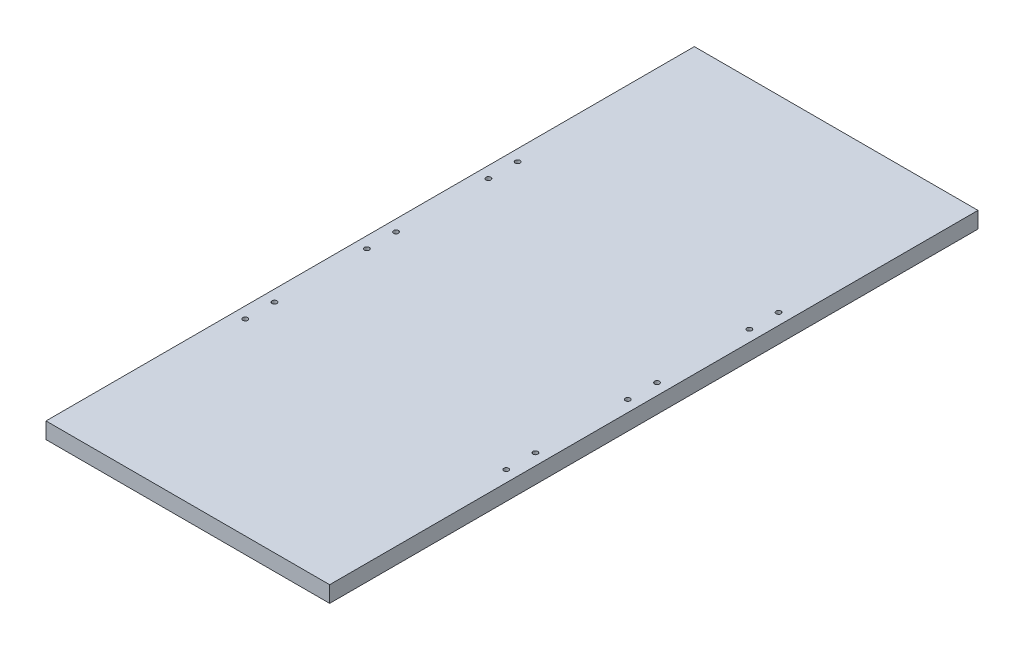
ISO-10303-21;
HEADER;
FILE_DESCRIPTION(('STEP AP214'),'2;1');
FILE_NAME('part.step','',(''),(''),'','','');
FILE_SCHEMA(('AUTOMOTIVE_DESIGN { 1 0 10303 214 1 1 1 1 }'));
ENDSEC;
DATA;
#1=APPLICATION_CONTEXT('core data for automotive mechanical design processes');
#2=APPLICATION_PROTOCOL_DEFINITION('international standard','automotive_design',2000,#1);
#3=PRODUCT_CONTEXT('',#1,'mechanical');
#4=PRODUCT('Part','Part','',(#3));
#5=PRODUCT_RELATED_PRODUCT_CATEGORY('part','',(#4));
#6=PRODUCT_DEFINITION_FORMATION('','',#4);
#7=PRODUCT_DEFINITION_CONTEXT('part definition',#1,'design');
#8=PRODUCT_DEFINITION('design','',#6,#7);
#9=PRODUCT_DEFINITION_SHAPE('','',#8);
#10=(LENGTH_UNIT() NAMED_UNIT(*) SI_UNIT(.MILLI.,.METRE.));
#11=(NAMED_UNIT(*) PLANE_ANGLE_UNIT() SI_UNIT($,.RADIAN.));
#12=(NAMED_UNIT(*) SI_UNIT($,.STERADIAN.) SOLID_ANGLE_UNIT());
#13=UNCERTAINTY_MEASURE_WITH_UNIT(LENGTH_MEASURE(1.E-05),#10,'distance_accuracy_value','');
#14=(GEOMETRIC_REPRESENTATION_CONTEXT(3) GLOBAL_UNCERTAINTY_ASSIGNED_CONTEXT((#13)) GLOBAL_UNIT_ASSIGNED_CONTEXT((#10,
#11,#12)) REPRESENTATION_CONTEXT('',''));
#15=CARTESIAN_POINT('',(0.,0.,0.));
#16=DIRECTION('',(0.,0.,1.));
#17=DIRECTION('',(1.,0.,0.));
#18=AXIS2_PLACEMENT_3D('',#15,#16,#17);
#19=CARTESIAN_POINT('',(87.4999999999999,10.,-200.));
#20=DIRECTION('',(-1.,0.,0.));
#21=DIRECTION('',(0.,0.,1.));
#22=AXIS2_PLACEMENT_3D('',#19,#20,#21);
#23=PLANE('',#22);
#24=DIRECTION('',(0.,0.,-1.));
#25=VECTOR('',#24,1.);
#26=CARTESIAN_POINT('',(87.4999999999999,0.,-200.));
#27=LINE('',#26,#25);
#28=CARTESIAN_POINT('',(87.5,0.,200.));
#29=VERTEX_POINT('',#28);
#30=CARTESIAN_POINT('',(87.4999999999999,0.,-200.));
#31=VERTEX_POINT('',#30);
#32=EDGE_CURVE('E96',#29,#31,#27,.T.);
#33=ORIENTED_EDGE('',*,*,#32,.T.);
#34=DIRECTION('',(0.,-1.,0.));
#35=VECTOR('',#34,1.);
#36=CARTESIAN_POINT('',(87.4999999999999,10.,-200.));
#37=LINE('',#36,#35);
#38=CARTESIAN_POINT('',(87.4999999999999,10.,-200.));
#39=VERTEX_POINT('',#38);
#40=EDGE_CURVE('E11',#39,#31,#37,.T.);
#41=ORIENTED_EDGE('',*,*,#40,.F.);
#42=DIRECTION('',(0.,0.,-1.));
#43=VECTOR('',#42,1.);
#44=CARTESIAN_POINT('',(87.4999999999999,10.,-200.));
#45=LINE('',#44,#43);
#46=CARTESIAN_POINT('',(87.5,10.,200.));
#47=VERTEX_POINT('',#46);
#48=EDGE_CURVE('E84',#47,#39,#45,.T.);
#49=ORIENTED_EDGE('',*,*,#48,.F.);
#50=DIRECTION('',(0.,-1.,0.));
#51=VECTOR('',#50,1.);
#52=CARTESIAN_POINT('',(87.5,10.,200.));
#53=LINE('',#52,#51);
#54=EDGE_CURVE('E92',#47,#29,#53,.T.);
#55=ORIENTED_EDGE('',*,*,#54,.T.);
#56=EDGE_LOOP('',(#33,#41,#49,#55));
#57=FACE_BOUND('',#56,.T.);
#58=ADVANCED_FACE('F33',(#57),#23,.F.);
#59=CARTESIAN_POINT('',(-87.5,10.,-200.));
#60=DIRECTION('',(0.,0.,1.));
#61=DIRECTION('',(1.,0.,0.));
#62=AXIS2_PLACEMENT_3D('',#59,#60,#61);
#63=PLANE('',#62);
#64=DIRECTION('',(-1.,0.,0.));
#65=VECTOR('',#64,1.);
#66=CARTESIAN_POINT('',(-87.5,0.,-200.));
#67=LINE('',#66,#65);
#68=CARTESIAN_POINT('',(-87.5,0.,-200.));
#69=VERTEX_POINT('',#68);
#70=EDGE_CURVE('E88',#31,#69,#67,.T.);
#71=ORIENTED_EDGE('',*,*,#70,.T.);
#72=DIRECTION('',(0.,-1.,0.));
#73=VECTOR('',#72,1.);
#74=CARTESIAN_POINT('',(-87.5,10.,-200.));
#75=LINE('',#74,#73);
#76=CARTESIAN_POINT('',(-87.5,10.,-200.));
#77=VERTEX_POINT('',#76);
#78=EDGE_CURVE('E41',#77,#69,#75,.T.);
#79=ORIENTED_EDGE('',*,*,#78,.F.);
#80=DIRECTION('',(-1.,0.,0.));
#81=VECTOR('',#80,1.);
#82=CARTESIAN_POINT('',(-87.5,10.,-200.));
#83=LINE('',#82,#81);
#84=EDGE_CURVE('E79',#39,#77,#83,.T.);
#85=ORIENTED_EDGE('',*,*,#84,.F.);
#86=ORIENTED_EDGE('',*,*,#40,.T.);
#87=EDGE_LOOP('',(#71,#79,#85,#86));
#88=FACE_BOUND('',#87,.T.);
#89=ADVANCED_FACE('F87',(#88),#63,.F.);
#90=CARTESIAN_POINT('',(-87.5,10.,-200.));
#91=DIRECTION('',(1.,0.,0.));
#92=DIRECTION('',(0.,0.,-1.));
#93=AXIS2_PLACEMENT_3D('',#90,#91,#92);
#94=PLANE('',#93);
#95=DIRECTION('',(0.,0.,1.));
#96=VECTOR('',#95,1.);
#97=CARTESIAN_POINT('',(-87.5,0.,-200.));
#98=LINE('',#97,#96);
#99=CARTESIAN_POINT('',(-87.5,0.,200.));
#100=VERTEX_POINT('',#99);
#101=EDGE_CURVE('E66',#69,#100,#98,.T.);
#102=ORIENTED_EDGE('',*,*,#101,.T.);
#103=DIRECTION('',(0.,-1.,0.));
#104=VECTOR('',#103,1.);
#105=CARTESIAN_POINT('',(-87.5,10.,200.));
#106=LINE('',#105,#104);
#107=CARTESIAN_POINT('',(-87.5,10.,200.));
#108=VERTEX_POINT('',#107);
#109=EDGE_CURVE('E89',#108,#100,#106,.T.);
#110=ORIENTED_EDGE('',*,*,#109,.F.);
#111=DIRECTION('',(0.,0.,1.));
#112=VECTOR('',#111,1.);
#113=CARTESIAN_POINT('',(-87.5,10.,-200.));
#114=LINE('',#113,#112);
#115=EDGE_CURVE('E82',#77,#108,#114,.T.);
#116=ORIENTED_EDGE('',*,*,#115,.F.);
#117=ORIENTED_EDGE('',*,*,#78,.T.);
#118=EDGE_LOOP('',(#102,#110,#116,#117));
#119=FACE_BOUND('',#118,.T.);
#120=ADVANCED_FACE('F90',(#119),#94,.F.);
#121=CARTESIAN_POINT('',(-87.5,10.,200.));
#122=DIRECTION('',(0.,0.,-1.));
#123=DIRECTION('',(-1.,0.,0.));
#124=AXIS2_PLACEMENT_3D('',#121,#122,#123);
#125=PLANE('',#124);
#126=DIRECTION('',(1.,0.,0.));
#127=VECTOR('',#126,1.);
#128=CARTESIAN_POINT('',(-87.5,0.,200.));
#129=LINE('',#128,#127);
#130=EDGE_CURVE('E72',#100,#29,#129,.T.);
#131=ORIENTED_EDGE('',*,*,#130,.T.);
#132=ORIENTED_EDGE('',*,*,#54,.F.);
#133=DIRECTION('',(1.,0.,0.));
#134=VECTOR('',#133,1.);
#135=CARTESIAN_POINT('',(-87.5,10.,200.));
#136=LINE('',#135,#134);
#137=EDGE_CURVE('E49',#108,#47,#136,.T.);
#138=ORIENTED_EDGE('',*,*,#137,.F.);
#139=ORIENTED_EDGE('',*,*,#109,.T.);
#140=EDGE_LOOP('',(#131,#132,#138,#139));
#141=FACE_BOUND('',#140,.T.);
#142=ADVANCED_FACE('F104',(#141),#125,.F.);
#143=CARTESIAN_POINT('',(0.,10.,0.));
#144=DIRECTION('',(0.,1.,0.));
#145=DIRECTION('',(0.,0.,1.));
#146=AXIS2_PLACEMENT_3D('',#143,#144,#145);
#147=PLANE('',#146);
#148=CARTESIAN_POINT('',(80.5,10.,-83.9600000000001));
#149=DIRECTION('',(0.,1.,0.));
#150=DIRECTION('',(0.,0.,-1.));
#151=AXIS2_PLACEMENT_3D('',#148,#149,#150);
#152=CIRCLE('',#151,1.5);
#153=CARTESIAN_POINT('',(80.5,10.,-85.4600000000001));
#154=VERTEX_POINT('',#153);
#155=EDGE_CURVE('E114',#154,#154,#152,.T.);
#156=ORIENTED_EDGE('',*,*,#155,.F.);
#157=EDGE_LOOP('',(#156));
#158=FACE_BOUND('',#157,.T.);
#159=CARTESIAN_POINT('',(80.5,10.,-65.9600000000001));
#160=DIRECTION('',(0.,1.,0.));
#161=DIRECTION('',(0.,0.,-1.));
#162=AXIS2_PLACEMENT_3D('',#159,#160,#161);
#163=CIRCLE('',#162,1.5);
#164=CARTESIAN_POINT('',(80.5,10.,-67.4600000000001));
#165=VERTEX_POINT('',#164);
#166=EDGE_CURVE('E173',#165,#165,#163,.T.);
#167=ORIENTED_EDGE('',*,*,#166,.F.);
#168=EDGE_LOOP('',(#167));
#169=FACE_BOUND('',#168,.T.);
#170=CARTESIAN_POINT('',(80.5,10.,-8.96000000000009));
#171=DIRECTION('',(0.,1.,0.));
#172=DIRECTION('',(0.,0.,-1.));
#173=AXIS2_PLACEMENT_3D('',#170,#171,#172);
#174=CIRCLE('',#173,1.5);
#175=CARTESIAN_POINT('',(80.5,10.,-10.4600000000001));
#176=VERTEX_POINT('',#175);
#177=EDGE_CURVE('E167',#176,#176,#174,.T.);
#178=ORIENTED_EDGE('',*,*,#177,.F.);
#179=EDGE_LOOP('',(#178));
#180=FACE_BOUND('',#179,.T.);
#181=CARTESIAN_POINT('',(80.5,10.,9.03999999999991));
#182=DIRECTION('',(0.,1.,0.));
#183=DIRECTION('',(0.,0.,-1.));
#184=AXIS2_PLACEMENT_3D('',#181,#182,#183);
#185=CIRCLE('',#184,1.5);
#186=CARTESIAN_POINT('',(80.5,10.,7.53999999999991));
#187=VERTEX_POINT('',#186);
#188=EDGE_CURVE('E161',#187,#187,#185,.T.);
#189=ORIENTED_EDGE('',*,*,#188,.F.);
#190=EDGE_LOOP('',(#189));
#191=FACE_BOUND('',#190,.T.);
#192=CARTESIAN_POINT('',(80.5,10.,66.0399999999999));
#193=DIRECTION('',(0.,1.,0.));
#194=DIRECTION('',(0.,0.,-1.));
#195=AXIS2_PLACEMENT_3D('',#192,#193,#194);
#196=CIRCLE('',#195,1.5);
#197=CARTESIAN_POINT('',(80.5,10.,64.5399999999999));
#198=VERTEX_POINT('',#197);
#199=EDGE_CURVE('E155',#198,#198,#196,.T.);
#200=ORIENTED_EDGE('',*,*,#199,.F.);
#201=EDGE_LOOP('',(#200));
#202=FACE_BOUND('',#201,.T.);
#203=CARTESIAN_POINT('',(80.5,10.,84.0399999999999));
#204=DIRECTION('',(0.,1.,0.));
#205=DIRECTION('',(0.,0.,-1.));
#206=AXIS2_PLACEMENT_3D('',#203,#204,#205);
#207=CIRCLE('',#206,1.5);
#208=CARTESIAN_POINT('',(80.5,10.,82.5399999999999));
#209=VERTEX_POINT('',#208);
#210=EDGE_CURVE('E149',#209,#209,#207,.T.);
#211=ORIENTED_EDGE('',*,*,#210,.F.);
#212=EDGE_LOOP('',(#211));
#213=FACE_BOUND('',#212,.T.);
#214=CARTESIAN_POINT('',(-80.5,10.,-83.9600000000001));
#215=DIRECTION('',(0.,-1.,0.));
#216=DIRECTION('',(0.,0.,-1.));
#217=AXIS2_PLACEMENT_3D('',#214,#215,#216);
#218=CIRCLE('',#217,1.5);
#219=CARTESIAN_POINT('',(-80.5,10.,-85.4600000000001));
#220=VERTEX_POINT('',#219);
#221=EDGE_CURVE('E99',#220,#220,#218,.T.);
#222=ORIENTED_EDGE('',*,*,#221,.T.);
#223=EDGE_LOOP('',(#222));
#224=FACE_BOUND('',#223,.T.);
#225=CARTESIAN_POINT('',(-80.5,10.,-65.9600000000001));
#226=DIRECTION('',(0.,-1.,0.));
#227=DIRECTION('',(0.,0.,-1.));
#228=AXIS2_PLACEMENT_3D('',#225,#226,#227);
#229=CIRCLE('',#228,1.5);
#230=CARTESIAN_POINT('',(-80.5,10.,-67.4600000000001));
#231=VERTEX_POINT('',#230);
#232=EDGE_CURVE('E138',#231,#231,#229,.T.);
#233=ORIENTED_EDGE('',*,*,#232,.T.);
#234=EDGE_LOOP('',(#233));
#235=FACE_BOUND('',#234,.T.);
#236=CARTESIAN_POINT('',(-80.5,10.,-8.96000000000009));
#237=DIRECTION('',(0.,-1.,0.));
#238=DIRECTION('',(0.,0.,-1.));
#239=AXIS2_PLACEMENT_3D('',#236,#237,#238);
#240=CIRCLE('',#239,1.5);
#241=CARTESIAN_POINT('',(-80.5,10.,-10.4600000000001));
#242=VERTEX_POINT('',#241);
#243=EDGE_CURVE('E132',#242,#242,#240,.T.);
#244=ORIENTED_EDGE('',*,*,#243,.T.);
#245=EDGE_LOOP('',(#244));
#246=FACE_BOUND('',#245,.T.);
#247=CARTESIAN_POINT('',(-80.5,10.,9.03999999999991));
#248=DIRECTION('',(0.,-1.,0.));
#249=DIRECTION('',(0.,0.,-1.));
#250=AXIS2_PLACEMENT_3D('',#247,#248,#249);
#251=CIRCLE('',#250,1.5);
#252=CARTESIAN_POINT('',(-80.5,10.,7.53999999999991));
#253=VERTEX_POINT('',#252);
#254=EDGE_CURVE('E126',#253,#253,#251,.T.);
#255=ORIENTED_EDGE('',*,*,#254,.T.);
#256=EDGE_LOOP('',(#255));
#257=FACE_BOUND('',#256,.T.);
#258=CARTESIAN_POINT('',(-80.5,10.,66.0399999999999));
#259=DIRECTION('',(0.,-1.,0.));
#260=DIRECTION('',(0.,0.,-1.));
#261=AXIS2_PLACEMENT_3D('',#258,#259,#260);
#262=CIRCLE('',#261,1.5);
#263=CARTESIAN_POINT('',(-80.5,10.,64.5399999999999));
#264=VERTEX_POINT('',#263);
#265=EDGE_CURVE('E120',#264,#264,#262,.T.);
#266=ORIENTED_EDGE('',*,*,#265,.T.);
#267=EDGE_LOOP('',(#266));
#268=FACE_BOUND('',#267,.T.);
#269=CARTESIAN_POINT('',(-80.5,10.,84.0399999999999));
#270=DIRECTION('',(0.,-1.,0.));
#271=DIRECTION('',(0.,0.,-1.));
#272=AXIS2_PLACEMENT_3D('',#269,#270,#271);
#273=CIRCLE('',#272,1.5);
#274=CARTESIAN_POINT('',(-80.5,10.,82.5399999999999));
#275=VERTEX_POINT('',#274);
#276=EDGE_CURVE('E113',#275,#275,#273,.T.);
#277=ORIENTED_EDGE('',*,*,#276,.T.);
#278=EDGE_LOOP('',(#277));
#279=FACE_BOUND('',#278,.T.);
#280=ORIENTED_EDGE('',*,*,#48,.T.);
#281=ORIENTED_EDGE('',*,*,#84,.T.);
#282=ORIENTED_EDGE('',*,*,#115,.T.);
#283=ORIENTED_EDGE('',*,*,#137,.T.);
#284=EDGE_LOOP('',(#280,#281,#282,#283));
#285=FACE_BOUND('',#284,.T.);
#286=ADVANCED_FACE('F80',(#158,#169,#180,#191,#202,#213,#224,#235,#246,#257,#268,#279,#285),
#147,.T.);
#287=CARTESIAN_POINT('',(0.,0.,0.));
#288=DIRECTION('',(0.,1.,0.));
#289=DIRECTION('',(0.,0.,1.));
#290=AXIS2_PLACEMENT_3D('',#287,#288,#289);
#291=PLANE('',#290);
#292=CARTESIAN_POINT('',(80.5,0.,-83.9600000000001));
#293=DIRECTION('',(0.,1.,0.));
#294=DIRECTION('',(0.,0.,-1.));
#295=AXIS2_PLACEMENT_3D('',#292,#293,#294);
#296=CIRCLE('',#295,1.5);
#297=CARTESIAN_POINT('',(80.5,0.,-85.4600000000001));
#298=VERTEX_POINT('',#297);
#299=EDGE_CURVE('E176',#298,#298,#296,.T.);
#300=ORIENTED_EDGE('',*,*,#299,.T.);
#301=EDGE_LOOP('',(#300));
#302=FACE_BOUND('',#301,.T.);
#303=CARTESIAN_POINT('',(80.5,0.,-65.9600000000001));
#304=DIRECTION('',(0.,1.,0.));
#305=DIRECTION('',(0.,0.,-1.));
#306=AXIS2_PLACEMENT_3D('',#303,#304,#305);
#307=CIRCLE('',#306,1.5);
#308=CARTESIAN_POINT('',(80.5,0.,-67.4600000000001));
#309=VERTEX_POINT('',#308);
#310=EDGE_CURVE('E170',#309,#309,#307,.T.);
#311=ORIENTED_EDGE('',*,*,#310,.T.);
#312=EDGE_LOOP('',(#311));
#313=FACE_BOUND('',#312,.T.);
#314=CARTESIAN_POINT('',(80.5,0.,-8.96000000000009));
#315=DIRECTION('',(0.,1.,0.));
#316=DIRECTION('',(0.,0.,-1.));
#317=AXIS2_PLACEMENT_3D('',#314,#315,#316);
#318=CIRCLE('',#317,1.5);
#319=CARTESIAN_POINT('',(80.5,0.,-10.4600000000001));
#320=VERTEX_POINT('',#319);
#321=EDGE_CURVE('E164',#320,#320,#318,.T.);
#322=ORIENTED_EDGE('',*,*,#321,.T.);
#323=EDGE_LOOP('',(#322));
#324=FACE_BOUND('',#323,.T.);
#325=CARTESIAN_POINT('',(80.5,0.,9.03999999999991));
#326=DIRECTION('',(0.,1.,0.));
#327=DIRECTION('',(0.,0.,-1.));
#328=AXIS2_PLACEMENT_3D('',#325,#326,#327);
#329=CIRCLE('',#328,1.5);
#330=CARTESIAN_POINT('',(80.5,0.,7.53999999999991));
#331=VERTEX_POINT('',#330);
#332=EDGE_CURVE('E158',#331,#331,#329,.T.);
#333=ORIENTED_EDGE('',*,*,#332,.T.);
#334=EDGE_LOOP('',(#333));
#335=FACE_BOUND('',#334,.T.);
#336=CARTESIAN_POINT('',(80.5,0.,66.0399999999999));
#337=DIRECTION('',(0.,1.,0.));
#338=DIRECTION('',(0.,0.,-1.));
#339=AXIS2_PLACEMENT_3D('',#336,#337,#338);
#340=CIRCLE('',#339,1.5);
#341=CARTESIAN_POINT('',(80.5,0.,64.5399999999999));
#342=VERTEX_POINT('',#341);
#343=EDGE_CURVE('E152',#342,#342,#340,.T.);
#344=ORIENTED_EDGE('',*,*,#343,.T.);
#345=EDGE_LOOP('',(#344));
#346=FACE_BOUND('',#345,.T.);
#347=CARTESIAN_POINT('',(80.5,0.,84.0399999999999));
#348=DIRECTION('',(0.,1.,0.));
#349=DIRECTION('',(0.,0.,-1.));
#350=AXIS2_PLACEMENT_3D('',#347,#348,#349);
#351=CIRCLE('',#350,1.5);
#352=CARTESIAN_POINT('',(80.5,0.,82.5399999999999));
#353=VERTEX_POINT('',#352);
#354=EDGE_CURVE('E146',#353,#353,#351,.T.);
#355=ORIENTED_EDGE('',*,*,#354,.T.);
#356=EDGE_LOOP('',(#355));
#357=FACE_BOUND('',#356,.T.);
#358=CARTESIAN_POINT('',(-80.5,0.,-83.9600000000001));
#359=DIRECTION('',(0.,-1.,0.));
#360=DIRECTION('',(0.,0.,-1.));
#361=AXIS2_PLACEMENT_3D('',#358,#359,#360);
#362=CIRCLE('',#361,1.5);
#363=CARTESIAN_POINT('',(-80.5,0.,-85.4600000000001));
#364=VERTEX_POINT('',#363);
#365=EDGE_CURVE('E141',#364,#364,#362,.T.);
#366=ORIENTED_EDGE('',*,*,#365,.F.);
#367=EDGE_LOOP('',(#366));
#368=FACE_BOUND('',#367,.T.);
#369=CARTESIAN_POINT('',(-80.5,0.,-65.9600000000001));
#370=DIRECTION('',(0.,-1.,0.));
#371=DIRECTION('',(0.,0.,-1.));
#372=AXIS2_PLACEMENT_3D('',#369,#370,#371);
#373=CIRCLE('',#372,1.5);
#374=CARTESIAN_POINT('',(-80.5,0.,-67.4600000000001));
#375=VERTEX_POINT('',#374);
#376=EDGE_CURVE('E135',#375,#375,#373,.T.);
#377=ORIENTED_EDGE('',*,*,#376,.F.);
#378=EDGE_LOOP('',(#377));
#379=FACE_BOUND('',#378,.T.);
#380=CARTESIAN_POINT('',(-80.5,0.,-8.96000000000009));
#381=DIRECTION('',(0.,-1.,0.));
#382=DIRECTION('',(0.,0.,-1.));
#383=AXIS2_PLACEMENT_3D('',#380,#381,#382);
#384=CIRCLE('',#383,1.5);
#385=CARTESIAN_POINT('',(-80.5,0.,-10.4600000000001));
#386=VERTEX_POINT('',#385);
#387=EDGE_CURVE('E129',#386,#386,#384,.T.);
#388=ORIENTED_EDGE('',*,*,#387,.F.);
#389=EDGE_LOOP('',(#388));
#390=FACE_BOUND('',#389,.T.);
#391=CARTESIAN_POINT('',(-80.5,0.,9.03999999999991));
#392=DIRECTION('',(0.,-1.,0.));
#393=DIRECTION('',(0.,0.,-1.));
#394=AXIS2_PLACEMENT_3D('',#391,#392,#393);
#395=CIRCLE('',#394,1.5);
#396=CARTESIAN_POINT('',(-80.5,0.,7.53999999999991));
#397=VERTEX_POINT('',#396);
#398=EDGE_CURVE('E123',#397,#397,#395,.T.);
#399=ORIENTED_EDGE('',*,*,#398,.F.);
#400=EDGE_LOOP('',(#399));
#401=FACE_BOUND('',#400,.T.);
#402=CARTESIAN_POINT('',(-80.5,0.,66.0399999999999));
#403=DIRECTION('',(0.,-1.,0.));
#404=DIRECTION('',(0.,0.,-1.));
#405=AXIS2_PLACEMENT_3D('',#402,#403,#404);
#406=CIRCLE('',#405,1.5);
#407=CARTESIAN_POINT('',(-80.5,0.,64.5399999999999));
#408=VERTEX_POINT('',#407);
#409=EDGE_CURVE('E117',#408,#408,#406,.T.);
#410=ORIENTED_EDGE('',*,*,#409,.F.);
#411=EDGE_LOOP('',(#410));
#412=FACE_BOUND('',#411,.T.);
#413=CARTESIAN_POINT('',(-80.5,0.,84.0399999999999));
#414=DIRECTION('',(0.,-1.,0.));
#415=DIRECTION('',(0.,0.,-1.));
#416=AXIS2_PLACEMENT_3D('',#413,#414,#415);
#417=CIRCLE('',#416,1.5);
#418=CARTESIAN_POINT('',(-80.5,0.,82.5399999999999));
#419=VERTEX_POINT('',#418);
#420=EDGE_CURVE('E110',#419,#419,#417,.T.);
#421=ORIENTED_EDGE('',*,*,#420,.F.);
#422=EDGE_LOOP('',(#421));
#423=FACE_BOUND('',#422,.T.);
#424=ORIENTED_EDGE('',*,*,#32,.F.);
#425=ORIENTED_EDGE('',*,*,#130,.F.);
#426=ORIENTED_EDGE('',*,*,#101,.F.);
#427=ORIENTED_EDGE('',*,*,#70,.F.);
#428=EDGE_LOOP('',(#424,#425,#426,#427));
#429=FACE_BOUND('',#428,.T.);
#430=ADVANCED_FACE('F107',(#302,#313,#324,#335,#346,#357,#368,#379,#390,#401,#412,#423,#429),
#291,.F.);
#431=CARTESIAN_POINT('',(-80.5,10.,84.0399999999999));
#432=DIRECTION('',(0.,-1.,0.));
#433=DIRECTION('',(0.,0.,-1.));
#434=AXIS2_PLACEMENT_3D('',#431,#432,#433);
#435=CYLINDRICAL_SURFACE('',#434,1.5);
#436=ORIENTED_EDGE('',*,*,#276,.F.);
#437=EDGE_LOOP('',(#436));
#438=FACE_BOUND('',#437,.T.);
#439=ORIENTED_EDGE('',*,*,#420,.T.);
#440=EDGE_LOOP('',(#439));
#441=FACE_BOUND('',#440,.T.);
#442=ADVANCED_FACE('F210',(#438,#441),#435,.F.);
#443=CARTESIAN_POINT('',(-80.5,10.,66.0399999999999));
#444=DIRECTION('',(0.,-1.,0.));
#445=DIRECTION('',(0.,0.,-1.));
#446=AXIS2_PLACEMENT_3D('',#443,#444,#445);
#447=CYLINDRICAL_SURFACE('',#446,1.5);
#448=ORIENTED_EDGE('',*,*,#265,.F.);
#449=EDGE_LOOP('',(#448));
#450=FACE_BOUND('',#449,.T.);
#451=ORIENTED_EDGE('',*,*,#409,.T.);
#452=EDGE_LOOP('',(#451));
#453=FACE_BOUND('',#452,.T.);
#454=ADVANCED_FACE('F213',(#450,#453),#447,.F.);
#455=CARTESIAN_POINT('',(-80.5,10.,9.03999999999991));
#456=DIRECTION('',(0.,-1.,0.));
#457=DIRECTION('',(0.,0.,-1.));
#458=AXIS2_PLACEMENT_3D('',#455,#456,#457);
#459=CYLINDRICAL_SURFACE('',#458,1.5);
#460=ORIENTED_EDGE('',*,*,#254,.F.);
#461=EDGE_LOOP('',(#460));
#462=FACE_BOUND('',#461,.T.);
#463=ORIENTED_EDGE('',*,*,#398,.T.);
#464=EDGE_LOOP('',(#463));
#465=FACE_BOUND('',#464,.T.);
#466=ADVANCED_FACE('F259',(#462,#465),#459,.F.);
#467=CARTESIAN_POINT('',(-80.5,10.,-8.96000000000009));
#468=DIRECTION('',(0.,-1.,0.));
#469=DIRECTION('',(0.,0.,-1.));
#470=AXIS2_PLACEMENT_3D('',#467,#468,#469);
#471=CYLINDRICAL_SURFACE('',#470,1.5);
#472=ORIENTED_EDGE('',*,*,#243,.F.);
#473=EDGE_LOOP('',(#472));
#474=FACE_BOUND('',#473,.T.);
#475=ORIENTED_EDGE('',*,*,#387,.T.);
#476=EDGE_LOOP('',(#475));
#477=FACE_BOUND('',#476,.T.);
#478=ADVANCED_FACE('F267',(#474,#477),#471,.F.);
#479=CARTESIAN_POINT('',(-80.5,10.,-65.9600000000001));
#480=DIRECTION('',(0.,-1.,0.));
#481=DIRECTION('',(0.,0.,-1.));
#482=AXIS2_PLACEMENT_3D('',#479,#480,#481);
#483=CYLINDRICAL_SURFACE('',#482,1.5);
#484=ORIENTED_EDGE('',*,*,#232,.F.);
#485=EDGE_LOOP('',(#484));
#486=FACE_BOUND('',#485,.T.);
#487=ORIENTED_EDGE('',*,*,#376,.T.);
#488=EDGE_LOOP('',(#487));
#489=FACE_BOUND('',#488,.T.);
#490=ADVANCED_FACE('F275',(#486,#489),#483,.F.);
#491=CARTESIAN_POINT('',(-80.5,10.,-83.9600000000001));
#492=DIRECTION('',(0.,-1.,0.));
#493=DIRECTION('',(0.,0.,-1.));
#494=AXIS2_PLACEMENT_3D('',#491,#492,#493);
#495=CYLINDRICAL_SURFACE('',#494,1.5);
#496=ORIENTED_EDGE('',*,*,#221,.F.);
#497=EDGE_LOOP('',(#496));
#498=FACE_BOUND('',#497,.T.);
#499=ORIENTED_EDGE('',*,*,#365,.T.);
#500=EDGE_LOOP('',(#499));
#501=FACE_BOUND('',#500,.T.);
#502=ADVANCED_FACE('F283',(#498,#501),#495,.F.);
#503=CARTESIAN_POINT('',(80.5,10.,84.0399999999999));
#504=DIRECTION('',(0.,-1.,0.));
#505=DIRECTION('',(0.,0.,-1.));
#506=AXIS2_PLACEMENT_3D('',#503,#504,#505);
#507=CYLINDRICAL_SURFACE('',#506,1.5);
#508=ORIENTED_EDGE('',*,*,#210,.T.);
#509=EDGE_LOOP('',(#508));
#510=FACE_BOUND('',#509,.T.);
#511=ORIENTED_EDGE('',*,*,#354,.F.);
#512=EDGE_LOOP('',(#511));
#513=FACE_BOUND('',#512,.T.);
#514=ADVANCED_FACE('F290',(#510,#513),#507,.F.);
#515=CARTESIAN_POINT('',(80.5,10.,66.0399999999999));
#516=DIRECTION('',(0.,-1.,0.));
#517=DIRECTION('',(0.,0.,-1.));
#518=AXIS2_PLACEMENT_3D('',#515,#516,#517);
#519=CYLINDRICAL_SURFACE('',#518,1.5);
#520=ORIENTED_EDGE('',*,*,#199,.T.);
#521=EDGE_LOOP('',(#520));
#522=FACE_BOUND('',#521,.T.);
#523=ORIENTED_EDGE('',*,*,#343,.F.);
#524=EDGE_LOOP('',(#523));
#525=FACE_BOUND('',#524,.T.);
#526=ADVANCED_FACE('F297',(#522,#525),#519,.F.);
#527=CARTESIAN_POINT('',(80.5,10.,9.03999999999991));
#528=DIRECTION('',(0.,-1.,0.));
#529=DIRECTION('',(0.,0.,-1.));
#530=AXIS2_PLACEMENT_3D('',#527,#528,#529);
#531=CYLINDRICAL_SURFACE('',#530,1.5);
#532=ORIENTED_EDGE('',*,*,#188,.T.);
#533=EDGE_LOOP('',(#532));
#534=FACE_BOUND('',#533,.T.);
#535=ORIENTED_EDGE('',*,*,#332,.F.);
#536=EDGE_LOOP('',(#535));
#537=FACE_BOUND('',#536,.T.);
#538=ADVANCED_FACE('F305',(#534,#537),#531,.F.);
#539=CARTESIAN_POINT('',(80.5,10.,-8.96000000000009));
#540=DIRECTION('',(0.,-1.,0.));
#541=DIRECTION('',(0.,0.,-1.));
#542=AXIS2_PLACEMENT_3D('',#539,#540,#541);
#543=CYLINDRICAL_SURFACE('',#542,1.5);
#544=ORIENTED_EDGE('',*,*,#177,.T.);
#545=EDGE_LOOP('',(#544));
#546=FACE_BOUND('',#545,.T.);
#547=ORIENTED_EDGE('',*,*,#321,.F.);
#548=EDGE_LOOP('',(#547));
#549=FACE_BOUND('',#548,.T.);
#550=ADVANCED_FACE('F313',(#546,#549),#543,.F.);
#551=CARTESIAN_POINT('',(80.5,10.,-65.9600000000001));
#552=DIRECTION('',(0.,-1.,0.));
#553=DIRECTION('',(0.,0.,-1.));
#554=AXIS2_PLACEMENT_3D('',#551,#552,#553);
#555=CYLINDRICAL_SURFACE('',#554,1.5);
#556=ORIENTED_EDGE('',*,*,#166,.T.);
#557=EDGE_LOOP('',(#556));
#558=FACE_BOUND('',#557,.T.);
#559=ORIENTED_EDGE('',*,*,#310,.F.);
#560=EDGE_LOOP('',(#559));
#561=FACE_BOUND('',#560,.T.);
#562=ADVANCED_FACE('F321',(#558,#561),#555,.F.);
#563=CARTESIAN_POINT('',(80.5,10.,-83.9600000000001));
#564=DIRECTION('',(0.,-1.,0.));
#565=DIRECTION('',(0.,0.,-1.));
#566=AXIS2_PLACEMENT_3D('',#563,#564,#565);
#567=CYLINDRICAL_SURFACE('',#566,1.5);
#568=ORIENTED_EDGE('',*,*,#155,.T.);
#569=EDGE_LOOP('',(#568));
#570=FACE_BOUND('',#569,.T.);
#571=ORIENTED_EDGE('',*,*,#299,.F.);
#572=EDGE_LOOP('',(#571));
#573=FACE_BOUND('',#572,.T.);
#574=ADVANCED_FACE('F182',(#570,#573),#567,.F.);
#575=CLOSED_SHELL('',(#58,#89,#120,#142,#286,#430,#442,#454,#466,#478,#490,#502,#514,#526,#538,
#550,#562,#574));
#576=MANIFOLD_SOLID_BREP('B2',#575);
#577=ADVANCED_BREP_SHAPE_REPRESENTATION('',(#18,#576),#14);
#578=SHAPE_DEFINITION_REPRESENTATION(#9,#577);
ENDSEC;
END-ISO-10303-21;
